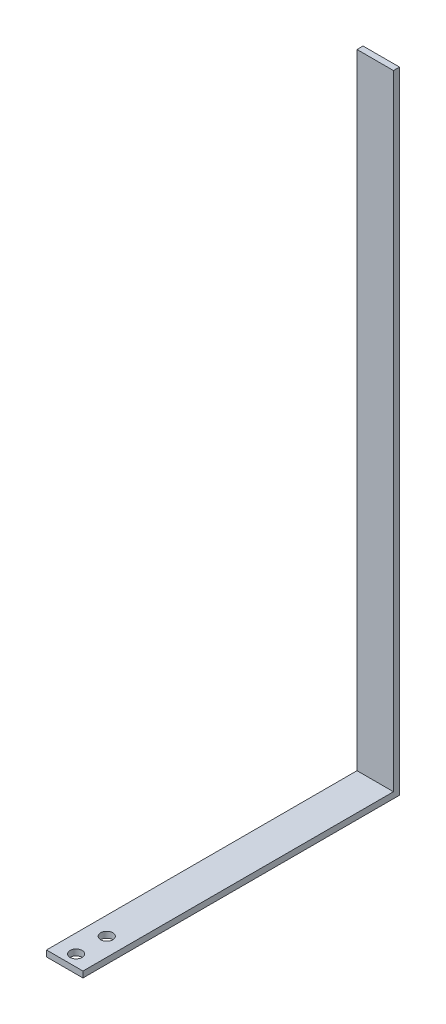
ISO-10303-21;
HEADER;
FILE_DESCRIPTION(('STEP AP214'),'2;1');
FILE_NAME('part.step','',(''),(''),'','','');
FILE_SCHEMA(('AUTOMOTIVE_DESIGN { 1 0 10303 214 1 1 1 1 }'));
ENDSEC;
DATA;
#1=APPLICATION_CONTEXT('core data for automotive mechanical design processes');
#2=APPLICATION_PROTOCOL_DEFINITION('international standard','automotive_design',2000,#1);
#3=PRODUCT_CONTEXT('',#1,'mechanical');
#4=PRODUCT('Part','Part','',(#3));
#5=PRODUCT_RELATED_PRODUCT_CATEGORY('part','',(#4));
#6=PRODUCT_DEFINITION_FORMATION('','',#4);
#7=PRODUCT_DEFINITION_CONTEXT('part definition',#1,'design');
#8=PRODUCT_DEFINITION('design','',#6,#7);
#9=PRODUCT_DEFINITION_SHAPE('','',#8);
#10=(LENGTH_UNIT() NAMED_UNIT(*) SI_UNIT(.MILLI.,.METRE.));
#11=(NAMED_UNIT(*) PLANE_ANGLE_UNIT() SI_UNIT($,.RADIAN.));
#12=(NAMED_UNIT(*) SI_UNIT($,.STERADIAN.) SOLID_ANGLE_UNIT());
#13=UNCERTAINTY_MEASURE_WITH_UNIT(LENGTH_MEASURE(1.E-05),#10,'distance_accuracy_value','');
#14=(GEOMETRIC_REPRESENTATION_CONTEXT(3) GLOBAL_UNCERTAINTY_ASSIGNED_CONTEXT((#13)) GLOBAL_UNIT_ASSIGNED_CONTEXT((#10,
#11,#12)) REPRESENTATION_CONTEXT('',''));
#15=CARTESIAN_POINT('',(0.,0.,0.));
#16=DIRECTION('',(0.,0.,1.));
#17=DIRECTION('',(1.,0.,0.));
#18=AXIS2_PLACEMENT_3D('',#15,#16,#17);
#19=CARTESIAN_POINT('',(19.05,3.155,330.7));
#20=DIRECTION('',(-1.,0.,0.));
#21=DIRECTION('',(0.,0.,1.));
#22=AXIS2_PLACEMENT_3D('',#19,#20,#21);
#23=PLANE('',#22);
#24=DIRECTION('',(0.,0.,-1.));
#25=VECTOR('',#24,1.);
#26=CARTESIAN_POINT('',(19.05,-3.155,330.7));
#27=LINE('',#26,#25);
#28=CARTESIAN_POINT('',(19.05,-3.155,330.7));
#29=VERTEX_POINT('',#28);
#30=CARTESIAN_POINT('',(19.05,-3.155,0.));
#31=VERTEX_POINT('',#30);
#32=EDGE_CURVE('E134',#29,#31,#27,.T.);
#33=ORIENTED_EDGE('',*,*,#32,.T.);
#34=DIRECTION('',(0.,1.,0.));
#35=VECTOR('',#34,1.);
#36=CARTESIAN_POINT('',(19.05,3.155,0.));
#37=LINE('',#36,#35);
#38=CARTESIAN_POINT('',(19.05,655.635,0.));
#39=VERTEX_POINT('',#38);
#40=EDGE_CURVE('E95',#31,#39,#37,.T.);
#41=ORIENTED_EDGE('',*,*,#40,.T.);
#42=DIRECTION('',(0.,0.,1.));
#43=VECTOR('',#42,1.);
#44=CARTESIAN_POINT('',(19.05,655.635,0.));
#45=LINE('',#44,#43);
#46=CARTESIAN_POINT('',(19.05,655.635,6.31));
#47=VERTEX_POINT('',#46);
#48=EDGE_CURVE('E105',#39,#47,#45,.T.);
#49=ORIENTED_EDGE('',*,*,#48,.T.);
#50=DIRECTION('',(0.,-1.,0.));
#51=VECTOR('',#50,1.);
#52=CARTESIAN_POINT('',(19.05,655.635,6.31));
#53=LINE('',#52,#51);
#54=CARTESIAN_POINT('',(19.05,3.155,6.31000000000004));
#55=VERTEX_POINT('',#54);
#56=EDGE_CURVE('E120',#47,#55,#53,.T.);
#57=ORIENTED_EDGE('',*,*,#56,.T.);
#58=DIRECTION('',(0.,0.,-1.));
#59=VECTOR('',#58,1.);
#60=CARTESIAN_POINT('',(19.05,3.155,330.7));
#61=LINE('',#60,#59);
#62=CARTESIAN_POINT('',(19.05,3.155,330.7));
#63=VERTEX_POINT('',#62);
#64=EDGE_CURVE('E11',#63,#55,#61,.T.);
#65=ORIENTED_EDGE('',*,*,#64,.F.);
#66=DIRECTION('',(0.,1.,0.));
#67=VECTOR('',#66,1.);
#68=CARTESIAN_POINT('',(19.05,3.155,330.7));
#69=LINE('',#68,#67);
#70=EDGE_CURVE('E125',#29,#63,#69,.T.);
#71=ORIENTED_EDGE('',*,*,#70,.F.);
#72=EDGE_LOOP('',(#33,#41,#49,#57,#65,#71));
#73=FACE_BOUND('',#72,.T.);
#74=ADVANCED_FACE('F35',(#73),#23,.F.);
#75=CARTESIAN_POINT('',(-19.05,3.155,330.7));
#76=DIRECTION('',(0.,-1.,0.));
#77=DIRECTION('',(0.,0.,-1.));
#78=AXIS2_PLACEMENT_3D('',#75,#76,#77);
#79=PLANE('',#78);
#80=CARTESIAN_POINT('',(-6.10622663543836E-12,3.155,318.807795334283));
#81=DIRECTION('',(0.,-1.,0.));
#82=DIRECTION('',(0.,0.,-1.));
#83=AXIS2_PLACEMENT_3D('',#80,#81,#82);
#84=CIRCLE('',#83,6.35000000000009);
#85=CARTESIAN_POINT('',(-6.10622663543836E-12,3.155,312.457795334282));
#86=VERTEX_POINT('',#85);
#87=EDGE_CURVE('E183',#86,#86,#84,.T.);
#88=ORIENTED_EDGE('',*,*,#87,.T.);
#89=EDGE_LOOP('',(#88));
#90=FACE_BOUND('',#89,.T.);
#91=CARTESIAN_POINT('',(-5.99520433297585E-12,3.155,286.807795334282));
#92=DIRECTION('',(0.,-1.,0.));
#93=DIRECTION('',(0.,0.,-1.));
#94=AXIS2_PLACEMENT_3D('',#91,#92,#93);
#95=CIRCLE('',#94,6.34999999999998);
#96=CARTESIAN_POINT('',(-5.99520433297585E-12,3.155,280.457795334282));
#97=VERTEX_POINT('',#96);
#98=EDGE_CURVE('E110',#97,#97,#95,.T.);
#99=ORIENTED_EDGE('',*,*,#98,.T.);
#100=EDGE_LOOP('',(#99));
#101=FACE_BOUND('',#100,.T.);
#102=ORIENTED_EDGE('',*,*,#64,.T.);
#103=DIRECTION('',(-1.,0.,0.));
#104=VECTOR('',#103,1.);
#105=CARTESIAN_POINT('',(-19.0499999999998,3.155,6.30999999999998));
#106=LINE('',#105,#104);
#107=CARTESIAN_POINT('',(-19.05,3.155,6.30999999999998));
#108=VERTEX_POINT('',#107);
#109=EDGE_CURVE('E51',#55,#108,#106,.T.);
#110=ORIENTED_EDGE('',*,*,#109,.T.);
#111=DIRECTION('',(0.,0.,-1.));
#112=VECTOR('',#111,1.);
#113=CARTESIAN_POINT('',(-19.05,3.155,330.7));
#114=LINE('',#113,#112);
#115=CARTESIAN_POINT('',(-19.05,3.155,330.7));
#116=VERTEX_POINT('',#115);
#117=EDGE_CURVE('E42',#116,#108,#114,.T.);
#118=ORIENTED_EDGE('',*,*,#117,.F.);
#119=DIRECTION('',(-1.,0.,0.));
#120=VECTOR('',#119,1.);
#121=CARTESIAN_POINT('',(-19.05,3.155,330.7));
#122=LINE('',#121,#120);
#123=EDGE_CURVE('E128',#63,#116,#122,.T.);
#124=ORIENTED_EDGE('',*,*,#123,.F.);
#125=EDGE_LOOP('',(#102,#110,#118,#124));
#126=FACE_BOUND('',#125,.T.);
#127=ADVANCED_FACE('F150',(#90,#101,#126),#79,.F.);
#128=CARTESIAN_POINT('',(-19.05,3.155,330.7));
#129=DIRECTION('',(1.,0.,0.));
#130=DIRECTION('',(0.,0.,-1.));
#131=AXIS2_PLACEMENT_3D('',#128,#129,#130);
#132=PLANE('',#131);
#133=ORIENTED_EDGE('',*,*,#117,.T.);
#134=DIRECTION('',(0.,-1.,0.));
#135=VECTOR('',#134,1.);
#136=CARTESIAN_POINT('',(-19.05,655.635,6.30999999999998));
#137=LINE('',#136,#135);
#138=CARTESIAN_POINT('',(-19.05,655.635,6.30999999999998));
#139=VERTEX_POINT('',#138);
#140=EDGE_CURVE('E109',#139,#108,#137,.T.);
#141=ORIENTED_EDGE('',*,*,#140,.F.);
#142=DIRECTION('',(0.,0.,-1.));
#143=VECTOR('',#142,1.);
#144=CARTESIAN_POINT('',(-19.05,655.635,0.));
#145=LINE('',#144,#143);
#146=CARTESIAN_POINT('',(-19.05,655.635,0.));
#147=VERTEX_POINT('',#146);
#148=EDGE_CURVE('E102',#139,#147,#145,.T.);
#149=ORIENTED_EDGE('',*,*,#148,.T.);
#150=DIRECTION('',(0.,-1.,0.));
#151=VECTOR('',#150,1.);
#152=CARTESIAN_POINT('',(-19.05,3.155,0.));
#153=LINE('',#152,#151);
#154=CARTESIAN_POINT('',(-19.05,-3.155,0.));
#155=VERTEX_POINT('',#154);
#156=EDGE_CURVE('E85',#147,#155,#153,.T.);
#157=ORIENTED_EDGE('',*,*,#156,.T.);
#158=DIRECTION('',(0.,0.,-1.));
#159=VECTOR('',#158,1.);
#160=CARTESIAN_POINT('',(-19.05,-3.155,330.7));
#161=LINE('',#160,#159);
#162=CARTESIAN_POINT('',(-19.05,-3.155,330.7));
#163=VERTEX_POINT('',#162);
#164=EDGE_CURVE('E138',#163,#155,#161,.T.);
#165=ORIENTED_EDGE('',*,*,#164,.F.);
#166=DIRECTION('',(0.,-1.,0.));
#167=VECTOR('',#166,1.);
#168=CARTESIAN_POINT('',(-19.05,3.155,330.7));
#169=LINE('',#168,#167);
#170=EDGE_CURVE('E130',#116,#163,#169,.T.);
#171=ORIENTED_EDGE('',*,*,#170,.F.);
#172=EDGE_LOOP('',(#133,#141,#149,#157,#165,#171));
#173=FACE_BOUND('',#172,.T.);
#174=ADVANCED_FACE('F107',(#173),#132,.F.);
#175=CARTESIAN_POINT('',(-19.05,-3.155,330.7));
#176=DIRECTION('',(0.,1.,0.));
#177=DIRECTION('',(0.,0.,1.));
#178=AXIS2_PLACEMENT_3D('',#175,#176,#177);
#179=PLANE('',#178);
#180=CARTESIAN_POINT('',(-6.10622663543836E-12,-3.155,318.807795334283));
#181=DIRECTION('',(0.,-1.,0.));
#182=DIRECTION('',(0.,0.,-1.));
#183=AXIS2_PLACEMENT_3D('',#180,#181,#182);
#184=CIRCLE('',#183,6.35000000000009);
#185=CARTESIAN_POINT('',(-6.10622663543836E-12,-3.155,312.457795334282));
#186=VERTEX_POINT('',#185);
#187=EDGE_CURVE('E186',#186,#186,#184,.T.);
#188=ORIENTED_EDGE('',*,*,#187,.F.);
#189=EDGE_LOOP('',(#188));
#190=FACE_BOUND('',#189,.T.);
#191=CARTESIAN_POINT('',(-5.99520433297585E-12,-3.155,286.807795334282));
#192=DIRECTION('',(0.,-1.,0.));
#193=DIRECTION('',(0.,0.,-1.));
#194=AXIS2_PLACEMENT_3D('',#191,#192,#193);
#195=CIRCLE('',#194,6.34999999999998);
#196=CARTESIAN_POINT('',(-5.99520433297585E-12,-3.155,280.457795334282));
#197=VERTEX_POINT('',#196);
#198=EDGE_CURVE('E113',#197,#197,#195,.T.);
#199=ORIENTED_EDGE('',*,*,#198,.F.);
#200=EDGE_LOOP('',(#199));
#201=FACE_BOUND('',#200,.T.);
#202=ORIENTED_EDGE('',*,*,#164,.T.);
#203=DIRECTION('',(1.,0.,0.));
#204=VECTOR('',#203,1.);
#205=CARTESIAN_POINT('',(-19.05,-3.155,0.));
#206=LINE('',#205,#204);
#207=EDGE_CURVE('E91',#155,#31,#206,.T.);
#208=ORIENTED_EDGE('',*,*,#207,.T.);
#209=ORIENTED_EDGE('',*,*,#32,.F.);
#210=DIRECTION('',(1.,0.,0.));
#211=VECTOR('',#210,1.);
#212=CARTESIAN_POINT('',(-19.05,-3.155,330.7));
#213=LINE('',#212,#211);
#214=EDGE_CURVE('E132',#163,#29,#213,.T.);
#215=ORIENTED_EDGE('',*,*,#214,.F.);
#216=EDGE_LOOP('',(#202,#208,#209,#215));
#217=FACE_BOUND('',#216,.T.);
#218=ADVANCED_FACE('F147',(#190,#201,#217),#179,.F.);
#219=CARTESIAN_POINT('',(0.,0.,330.7));
#220=DIRECTION('',(0.,0.,1.));
#221=DIRECTION('',(1.,0.,0.));
#222=AXIS2_PLACEMENT_3D('',#219,#220,#221);
#223=PLANE('',#222);
#224=ORIENTED_EDGE('',*,*,#70,.T.);
#225=ORIENTED_EDGE('',*,*,#123,.T.);
#226=ORIENTED_EDGE('',*,*,#170,.T.);
#227=ORIENTED_EDGE('',*,*,#214,.T.);
#228=EDGE_LOOP('',(#224,#225,#226,#227));
#229=FACE_BOUND('',#228,.T.);
#230=ADVANCED_FACE('F149',(#229),#223,.T.);
#231=CARTESIAN_POINT('',(0.,0.,0.));
#232=DIRECTION('',(0.,0.,1.));
#233=DIRECTION('',(1.,0.,0.));
#234=AXIS2_PLACEMENT_3D('',#231,#232,#233);
#235=PLANE('',#234);
#236=ORIENTED_EDGE('',*,*,#40,.F.);
#237=ORIENTED_EDGE('',*,*,#207,.F.);
#238=ORIENTED_EDGE('',*,*,#156,.F.);
#239=DIRECTION('',(1.,0.,0.));
#240=VECTOR('',#239,1.);
#241=CARTESIAN_POINT('',(19.05,655.635,0.));
#242=LINE('',#241,#240);
#243=EDGE_CURVE('E89',#147,#39,#242,.T.);
#244=ORIENTED_EDGE('',*,*,#243,.T.);
#245=EDGE_LOOP('',(#236,#237,#238,#244));
#246=FACE_BOUND('',#245,.T.);
#247=ADVANCED_FACE('F88',(#246),#235,.F.);
#248=CARTESIAN_POINT('',(19.05,655.635,6.31));
#249=DIRECTION('',(0.,0.,1.));
#250=DIRECTION('',(1.,0.,0.));
#251=AXIS2_PLACEMENT_3D('',#248,#249,#250);
#252=PLANE('',#251);
#253=ORIENTED_EDGE('',*,*,#109,.F.);
#254=ORIENTED_EDGE('',*,*,#56,.F.);
#255=DIRECTION('',(-1.,0.,0.));
#256=VECTOR('',#255,1.);
#257=CARTESIAN_POINT('',(19.05,655.635,6.31));
#258=LINE('',#257,#256);
#259=EDGE_CURVE('E118',#47,#139,#258,.T.);
#260=ORIENTED_EDGE('',*,*,#259,.T.);
#261=ORIENTED_EDGE('',*,*,#140,.T.);
#262=EDGE_LOOP('',(#253,#254,#260,#261));
#263=FACE_BOUND('',#262,.T.);
#264=ADVANCED_FACE('F141',(#263),#252,.T.);
#265=CARTESIAN_POINT('',(0.,655.635,0.));
#266=DIRECTION('',(0.,-1.,0.));
#267=DIRECTION('',(0.,0.,-1.));
#268=AXIS2_PLACEMENT_3D('',#265,#266,#267);
#269=PLANE('',#268);
#270=ORIENTED_EDGE('',*,*,#148,.F.);
#271=ORIENTED_EDGE('',*,*,#259,.F.);
#272=ORIENTED_EDGE('',*,*,#48,.F.);
#273=ORIENTED_EDGE('',*,*,#243,.F.);
#274=EDGE_LOOP('',(#270,#271,#272,#273));
#275=FACE_BOUND('',#274,.T.);
#276=ADVANCED_FACE('F100',(#275),#269,.F.);
#277=CARTESIAN_POINT('',(-5.99520433297585E-12,3.155,286.807795334282));
#278=DIRECTION('',(0.,-1.,0.));
#279=DIRECTION('',(0.,0.,-1.));
#280=AXIS2_PLACEMENT_3D('',#277,#278,#279);
#281=CYLINDRICAL_SURFACE('',#280,6.34999999999998);
#282=ORIENTED_EDGE('',*,*,#98,.F.);
#283=EDGE_LOOP('',(#282));
#284=FACE_BOUND('',#283,.T.);
#285=ORIENTED_EDGE('',*,*,#198,.T.);
#286=EDGE_LOOP('',(#285));
#287=FACE_BOUND('',#286,.T.);
#288=ADVANCED_FACE('F172',(#284,#287),#281,.F.);
#289=CARTESIAN_POINT('',(-6.10622663543836E-12,3.155,318.807795334283));
#290=DIRECTION('',(0.,-1.,0.));
#291=DIRECTION('',(0.,0.,-1.));
#292=AXIS2_PLACEMENT_3D('',#289,#290,#291);
#293=CYLINDRICAL_SURFACE('',#292,6.35000000000009);
#294=ORIENTED_EDGE('',*,*,#87,.F.);
#295=EDGE_LOOP('',(#294));
#296=FACE_BOUND('',#295,.T.);
#297=ORIENTED_EDGE('',*,*,#187,.T.);
#298=EDGE_LOOP('',(#297));
#299=FACE_BOUND('',#298,.T.);
#300=ADVANCED_FACE('F175',(#296,#299),#293,.F.);
#301=CLOSED_SHELL('',(#74,#127,#174,#218,#230,#247,#264,#276,#288,#300));
#302=MANIFOLD_SOLID_BREP('B2',#301);
#303=ADVANCED_BREP_SHAPE_REPRESENTATION('',(#18,#302),#14);
#304=SHAPE_DEFINITION_REPRESENTATION(#9,#303);
ENDSEC;
END-ISO-10303-21;
